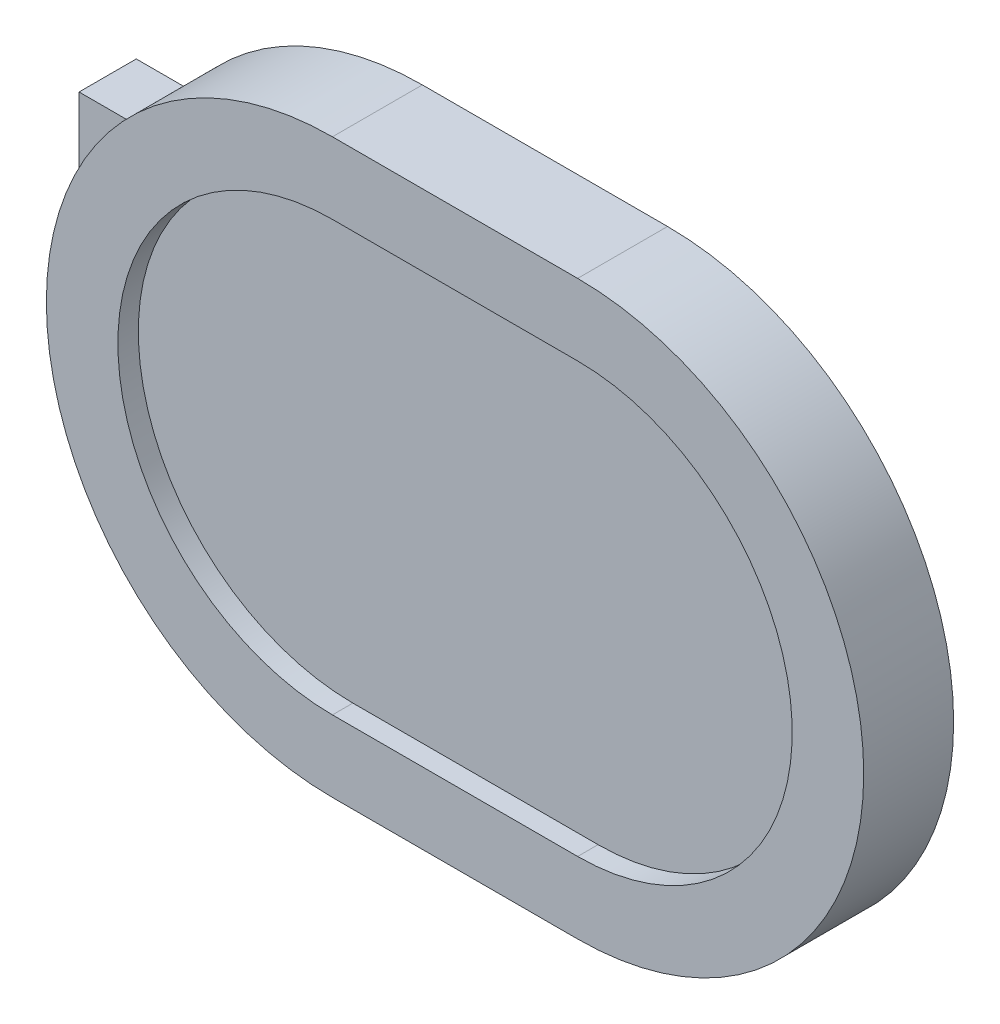
ISO-10303-21;
HEADER;
FILE_DESCRIPTION(('STEP AP214'),'2;1');
FILE_NAME('part.step','',(''),(''),'','','');
FILE_SCHEMA(('AUTOMOTIVE_DESIGN { 1 0 10303 214 1 1 1 1 }'));
ENDSEC;
DATA;
#1=APPLICATION_CONTEXT('core data for automotive mechanical design processes');
#2=APPLICATION_PROTOCOL_DEFINITION('international standard','automotive_design',2000,#1);
#3=PRODUCT_CONTEXT('',#1,'mechanical');
#4=PRODUCT('Part','Part','',(#3));
#5=PRODUCT_RELATED_PRODUCT_CATEGORY('part','',(#4));
#6=PRODUCT_DEFINITION_FORMATION('','',#4);
#7=PRODUCT_DEFINITION_CONTEXT('part definition',#1,'design');
#8=PRODUCT_DEFINITION('design','',#6,#7);
#9=PRODUCT_DEFINITION_SHAPE('','',#8);
#10=(LENGTH_UNIT() NAMED_UNIT(*) SI_UNIT(.MILLI.,.METRE.));
#11=(NAMED_UNIT(*) PLANE_ANGLE_UNIT() SI_UNIT($,.RADIAN.));
#12=(NAMED_UNIT(*) SI_UNIT($,.STERADIAN.) SOLID_ANGLE_UNIT());
#13=UNCERTAINTY_MEASURE_WITH_UNIT(LENGTH_MEASURE(1.E-05),#10,'distance_accuracy_value','');
#14=(GEOMETRIC_REPRESENTATION_CONTEXT(3) GLOBAL_UNCERTAINTY_ASSIGNED_CONTEXT((#13)) GLOBAL_UNIT_ASSIGNED_CONTEXT((#10,
#11,#12)) REPRESENTATION_CONTEXT('',''));
#15=CARTESIAN_POINT('',(0.,0.,0.));
#16=DIRECTION('',(0.,0.,1.));
#17=DIRECTION('',(1.,0.,0.));
#18=AXIS2_PLACEMENT_3D('',#15,#16,#17);
#19=CARTESIAN_POINT('',(3.,0.,0.8));
#20=DIRECTION('',(0.,0.,1.));
#21=DIRECTION('',(1.,0.,0.));
#22=AXIS2_PLACEMENT_3D('',#19,#20,#21);
#23=PLANE('',#22);
#24=DIRECTION('',(0.,1.,0.));
#25=VECTOR('',#24,1.);
#26=CARTESIAN_POINT('',(-9.7,1.25,0.8));
#27=LINE('',#26,#25);
#28=CARTESIAN_POINT('',(-9.7,1.25,0.8));
#29=VERTEX_POINT('',#28);
#30=CARTESIAN_POINT('',(-9.7,3.75,0.8));
#31=VERTEX_POINT('',#30);
#32=EDGE_CURVE('E201',#29,#31,#27,.T.);
#33=ORIENTED_EDGE('',*,*,#32,.F.);
#34=DIRECTION('',(-1.,0.,0.));
#35=VECTOR('',#34,1.);
#36=CARTESIAN_POINT('',(-7.2,1.25,0.8));
#37=LINE('',#36,#35);
#38=CARTESIAN_POINT('',(-7.2,1.25,0.8));
#39=VERTEX_POINT('',#38);
#40=EDGE_CURVE('E214',#39,#29,#37,.T.);
#41=ORIENTED_EDGE('',*,*,#40,.F.);
#42=DIRECTION('',(0.,-1.,0.));
#43=VECTOR('',#42,1.);
#44=CARTESIAN_POINT('',(-7.2,1.25,0.8));
#45=LINE('',#44,#43);
#46=CARTESIAN_POINT('',(-7.2,3.75,0.8));
#47=VERTEX_POINT('',#46);
#48=EDGE_CURVE('E223',#47,#39,#45,.T.);
#49=ORIENTED_EDGE('',*,*,#48,.F.);
#50=DIRECTION('',(1.,0.,0.));
#51=VECTOR('',#50,1.);
#52=CARTESIAN_POINT('',(-7.2,3.75,0.8));
#53=LINE('',#52,#51);
#54=EDGE_CURVE('E204',#31,#47,#53,.T.);
#55=ORIENTED_EDGE('',*,*,#54,.F.);
#56=EDGE_LOOP('',(#33,#41,#49,#55));
#57=FACE_BOUND('',#56,.T.);
#58=CARTESIAN_POINT('',(0.,0.,0.8));
#59=DIRECTION('',(0.,0.,1.));
#60=DIRECTION('',(1.,0.,0.));
#61=AXIS2_PLACEMENT_3D('',#58,#59,#60);
#62=CIRCLE('',#61,5.3);
#63=CARTESIAN_POINT('',(5.3,0.,0.8));
#64=VERTEX_POINT('',#63);
#65=EDGE_CURVE('E335',#64,#64,#62,.T.);
#66=ORIENTED_EDGE('',*,*,#65,.T.);
#67=EDGE_LOOP('',(#66));
#68=FACE_BOUND('',#67,.T.);
#69=CARTESIAN_POINT('',(-3.,0.,0.8));
#70=DIRECTION('',(0.,0.,1.));
#71=DIRECTION('',(1.,0.,0.));
#72=AXIS2_PLACEMENT_3D('',#69,#70,#71);
#73=CIRCLE('',#72,7.);
#74=CARTESIAN_POINT('',(-8.7094220372994,-4.05,0.8));
#75=VERTEX_POINT('',#74);
#76=CARTESIAN_POINT('',(-3.,-7.,0.8));
#77=VERTEX_POINT('',#76);
#78=EDGE_CURVE('E309',#75,#77,#73,.T.);
#79=ORIENTED_EDGE('',*,*,#78,.F.);
#80=DIRECTION('',(-1.,0.,0.));
#81=VECTOR('',#80,1.);
#82=CARTESIAN_POINT('',(-10.,-4.05,0.8));
#83=LINE('',#82,#81);
#84=CARTESIAN_POINT('',(-10.,-4.05,0.8));
#85=VERTEX_POINT('',#84);
#86=EDGE_CURVE('E239',#75,#85,#83,.T.);
#87=ORIENTED_EDGE('',*,*,#86,.T.);
#88=DIRECTION('',(0.,1.,0.));
#89=VECTOR('',#88,1.);
#90=CARTESIAN_POINT('',(-10.,4.05,0.8));
#91=LINE('',#90,#89);
#92=CARTESIAN_POINT('',(-10.,4.05,0.8));
#93=VERTEX_POINT('',#92);
#94=EDGE_CURVE('E244',#85,#93,#91,.T.);
#95=ORIENTED_EDGE('',*,*,#94,.T.);
#96=DIRECTION('',(1.,0.,0.));
#97=VECTOR('',#96,1.);
#98=CARTESIAN_POINT('',(-8.7094220372994,4.05,0.8));
#99=LINE('',#98,#97);
#100=CARTESIAN_POINT('',(-8.7094220372994,4.05,0.8));
#101=VERTEX_POINT('',#100);
#102=EDGE_CURVE('E240',#93,#101,#99,.T.);
#103=ORIENTED_EDGE('',*,*,#102,.T.);
#104=CARTESIAN_POINT('',(-3.,7.,0.8));
#105=VERTEX_POINT('',#104);
#106=EDGE_CURVE('E306',#105,#101,#73,.T.);
#107=ORIENTED_EDGE('',*,*,#106,.F.);
#108=DIRECTION('',(-1.,0.,0.));
#109=VECTOR('',#108,1.);
#110=CARTESIAN_POINT('',(3.,7.,0.8));
#111=LINE('',#110,#109);
#112=CARTESIAN_POINT('',(3.,7.,0.8));
#113=VERTEX_POINT('',#112);
#114=EDGE_CURVE('E310',#113,#105,#111,.T.);
#115=ORIENTED_EDGE('',*,*,#114,.F.);
#116=CARTESIAN_POINT('',(3.,0.,0.8));
#117=DIRECTION('',(0.,0.,1.));
#118=DIRECTION('',(1.,0.,0.));
#119=AXIS2_PLACEMENT_3D('',#116,#117,#118);
#120=CIRCLE('',#119,7.);
#121=CARTESIAN_POINT('',(3.,-7.,0.8));
#122=VERTEX_POINT('',#121);
#123=EDGE_CURVE('E315',#122,#113,#120,.T.);
#124=ORIENTED_EDGE('',*,*,#123,.F.);
#125=DIRECTION('',(1.,0.,0.));
#126=VECTOR('',#125,1.);
#127=CARTESIAN_POINT('',(3.,-7.,0.8));
#128=LINE('',#127,#126);
#129=EDGE_CURVE('E301',#77,#122,#128,.T.);
#130=ORIENTED_EDGE('',*,*,#129,.F.);
#131=EDGE_LOOP('',(#79,#87,#95,#103,#107,#115,#124,#130));
#132=FACE_BOUND('',#131,.T.);
#133=DIRECTION('',(1.,0.,0.));
#134=VECTOR('',#133,1.);
#135=CARTESIAN_POINT('',(-7.2,-1.25,0.8));
#136=LINE('',#135,#134);
#137=CARTESIAN_POINT('',(-9.7,-1.25,0.8));
#138=VERTEX_POINT('',#137);
#139=CARTESIAN_POINT('',(-7.2,-1.25,0.8));
#140=VERTEX_POINT('',#139);
#141=EDGE_CURVE('E200',#138,#140,#136,.T.);
#142=ORIENTED_EDGE('',*,*,#141,.F.);
#143=DIRECTION('',(0.,1.,0.));
#144=VECTOR('',#143,1.);
#145=CARTESIAN_POINT('',(-9.7,-1.25,0.8));
#146=LINE('',#145,#144);
#147=CARTESIAN_POINT('',(-9.7,-3.75,0.8));
#148=VERTEX_POINT('',#147);
#149=EDGE_CURVE('E197',#148,#138,#146,.T.);
#150=ORIENTED_EDGE('',*,*,#149,.F.);
#151=DIRECTION('',(-1.,0.,0.));
#152=VECTOR('',#151,1.);
#153=CARTESIAN_POINT('',(-7.2,-3.75,0.8));
#154=LINE('',#153,#152);
#155=CARTESIAN_POINT('',(-7.2,-3.75,0.8));
#156=VERTEX_POINT('',#155);
#157=EDGE_CURVE('E60',#156,#148,#154,.T.);
#158=ORIENTED_EDGE('',*,*,#157,.F.);
#159=DIRECTION('',(0.,-1.,0.));
#160=VECTOR('',#159,1.);
#161=CARTESIAN_POINT('',(-7.2,-1.25,0.8));
#162=LINE('',#161,#160);
#163=EDGE_CURVE('E55',#140,#156,#162,.T.);
#164=ORIENTED_EDGE('',*,*,#163,.F.);
#165=EDGE_LOOP('',(#142,#150,#158,#164));
#166=FACE_BOUND('',#165,.T.);
#167=ADVANCED_FACE('F40',(#57,#68,#132,#166),#23,.F.);
#168=CARTESIAN_POINT('',(0.,0.,0.8));
#169=DIRECTION('',(0.,0.,-1.));
#170=DIRECTION('',(-1.,0.,0.));
#171=AXIS2_PLACEMENT_3D('',#168,#169,#170);
#172=CYLINDRICAL_SURFACE('',#171,5.3);
#173=ORIENTED_EDGE('',*,*,#65,.F.);
#174=EDGE_LOOP('',(#173));
#175=FACE_BOUND('',#174,.T.);
#176=CARTESIAN_POINT('',(0.,0.,0.));
#177=DIRECTION('',(0.,0.,1.));
#178=DIRECTION('',(1.,0.,0.));
#179=AXIS2_PLACEMENT_3D('',#176,#177,#178);
#180=CIRCLE('',#179,5.3);
#181=CARTESIAN_POINT('',(5.3,0.,0.));
#182=VERTEX_POINT('',#181);
#183=EDGE_CURVE('E321',#182,#182,#180,.T.);
#184=ORIENTED_EDGE('',*,*,#183,.T.);
#185=EDGE_LOOP('',(#184));
#186=FACE_BOUND('',#185,.T.);
#187=ADVANCED_FACE('F42',(#175,#186),#172,.T.);
#188=CARTESIAN_POINT('',(0.,0.,0.));
#189=DIRECTION('',(0.,0.,1.));
#190=DIRECTION('',(1.,0.,0.));
#191=AXIS2_PLACEMENT_3D('',#188,#189,#190);
#192=PLANE('',#191);
#193=ORIENTED_EDGE('',*,*,#183,.F.);
#194=EDGE_LOOP('',(#193));
#195=FACE_BOUND('',#194,.T.);
#196=ADVANCED_FACE('F341',(#195),#192,.F.);
#197=CARTESIAN_POINT('',(3.,0.,30.4131112314674));
#198=DIRECTION('',(0.,0.,-1.));
#199=DIRECTION('',(-1.,0.,0.));
#200=AXIS2_PLACEMENT_3D('',#197,#198,#199);
#201=CYLINDRICAL_SURFACE('',#200,7.);
#202=CARTESIAN_POINT('',(3.,0.,3.));
#203=DIRECTION('',(0.,0.,1.));
#204=DIRECTION('',(1.,0.,0.));
#205=AXIS2_PLACEMENT_3D('',#202,#203,#204);
#206=CIRCLE('',#205,7.);
#207=CARTESIAN_POINT('',(3.,-7.,3.));
#208=VERTEX_POINT('',#207);
#209=CARTESIAN_POINT('',(3.,7.,3.));
#210=VERTEX_POINT('',#209);
#211=EDGE_CURVE('E325',#208,#210,#206,.T.);
#212=ORIENTED_EDGE('',*,*,#211,.F.);
#213=DIRECTION('',(0.,0.,-1.));
#214=VECTOR('',#213,1.);
#215=CARTESIAN_POINT('',(3.,-7.,30.4131112314674));
#216=LINE('',#215,#214);
#217=EDGE_CURVE('E294',#208,#122,#216,.T.);
#218=ORIENTED_EDGE('',*,*,#217,.T.);
#219=ORIENTED_EDGE('',*,*,#123,.T.);
#220=DIRECTION('',(0.,0.,-1.));
#221=VECTOR('',#220,1.);
#222=CARTESIAN_POINT('',(3.,7.,30.4131112314674));
#223=LINE('',#222,#221);
#224=EDGE_CURVE('E314',#210,#113,#223,.T.);
#225=ORIENTED_EDGE('',*,*,#224,.F.);
#226=EDGE_LOOP('',(#212,#218,#219,#225));
#227=FACE_BOUND('',#226,.T.);
#228=ADVANCED_FACE('F343',(#227),#201,.T.);
#229=CARTESIAN_POINT('',(3.,7.,30.4131112314674));
#230=DIRECTION('',(0.,-1.,0.));
#231=DIRECTION('',(1.,0.,0.));
#232=AXIS2_PLACEMENT_3D('',#229,#230,#231);
#233=PLANE('',#232);
#234=DIRECTION('',(-1.,0.,0.));
#235=VECTOR('',#234,1.);
#236=CARTESIAN_POINT('',(3.,7.,3.));
#237=LINE('',#236,#235);
#238=CARTESIAN_POINT('',(-3.,7.,3.));
#239=VERTEX_POINT('',#238);
#240=EDGE_CURVE('E322',#210,#239,#237,.T.);
#241=ORIENTED_EDGE('',*,*,#240,.F.);
#242=ORIENTED_EDGE('',*,*,#224,.T.);
#243=ORIENTED_EDGE('',*,*,#114,.T.);
#244=DIRECTION('',(0.,0.,-1.));
#245=VECTOR('',#244,1.);
#246=CARTESIAN_POINT('',(-3.,7.,30.4131112314674));
#247=LINE('',#246,#245);
#248=EDGE_CURVE('E313',#239,#105,#247,.T.);
#249=ORIENTED_EDGE('',*,*,#248,.F.);
#250=EDGE_LOOP('',(#241,#242,#243,#249));
#251=FACE_BOUND('',#250,.T.);
#252=ADVANCED_FACE('F348',(#251),#233,.F.);
#253=CARTESIAN_POINT('',(-3.,0.,30.4131112314674));
#254=DIRECTION('',(0.,0.,-1.));
#255=DIRECTION('',(-1.,0.,0.));
#256=AXIS2_PLACEMENT_3D('',#253,#254,#255);
#257=CYLINDRICAL_SURFACE('',#256,7.);
#258=ORIENTED_EDGE('',*,*,#106,.T.);
#259=DIRECTION('',(0.,0.,-1.));
#260=VECTOR('',#259,1.);
#261=CARTESIAN_POINT('',(-8.7094220372994,4.05,11.2021699249533));
#262=LINE('',#261,#260);
#263=CARTESIAN_POINT('',(-8.7094220372994,4.05,2.2));
#264=VERTEX_POINT('',#263);
#265=EDGE_CURVE('E260',#264,#101,#262,.T.);
#266=ORIENTED_EDGE('',*,*,#265,.F.);
#267=CARTESIAN_POINT('',(-3.,0.,2.2));
#268=DIRECTION('',(0.,0.,1.));
#269=DIRECTION('',(1.,0.,0.));
#270=AXIS2_PLACEMENT_3D('',#267,#268,#269);
#271=CIRCLE('',#270,7.);
#272=CARTESIAN_POINT('',(-10.,0.,2.2));
#273=VERTEX_POINT('',#272);
#274=EDGE_CURVE('E12',#264,#273,#271,.T.);
#275=ORIENTED_EDGE('',*,*,#274,.T.);
#276=CARTESIAN_POINT('',(-8.7094220372994,-4.05,2.2));
#277=VERTEX_POINT('',#276);
#278=EDGE_CURVE('E44',#273,#277,#271,.T.);
#279=ORIENTED_EDGE('',*,*,#278,.T.);
#280=DIRECTION('',(0.,0.,-1.));
#281=VECTOR('',#280,1.);
#282=CARTESIAN_POINT('',(-8.7094220372994,-4.05,11.2021699249533));
#283=LINE('',#282,#281);
#284=EDGE_CURVE('E256',#277,#75,#283,.T.);
#285=ORIENTED_EDGE('',*,*,#284,.T.);
#286=ORIENTED_EDGE('',*,*,#78,.T.);
#287=DIRECTION('',(0.,0.,-1.));
#288=VECTOR('',#287,1.);
#289=CARTESIAN_POINT('',(-3.,-7.,30.4131112314674));
#290=LINE('',#289,#288);
#291=CARTESIAN_POINT('',(-3.,-7.,3.));
#292=VERTEX_POINT('',#291);
#293=EDGE_CURVE('E305',#292,#77,#290,.T.);
#294=ORIENTED_EDGE('',*,*,#293,.F.);
#295=CARTESIAN_POINT('',(-3.,0.,3.));
#296=DIRECTION('',(0.,0.,1.));
#297=DIRECTION('',(1.,0.,0.));
#298=AXIS2_PLACEMENT_3D('',#295,#296,#297);
#299=CIRCLE('',#298,7.);
#300=EDGE_CURVE('E318',#239,#292,#299,.T.);
#301=ORIENTED_EDGE('',*,*,#300,.F.);
#302=ORIENTED_EDGE('',*,*,#248,.T.);
#303=EDGE_LOOP('',(#258,#266,#275,#279,#285,#286,#294,#301,#302));
#304=FACE_BOUND('',#303,.T.);
#305=ADVANCED_FACE('F367',(#304),#257,.T.);
#306=CARTESIAN_POINT('',(3.,-7.,30.4131112314674));
#307=DIRECTION('',(0.,1.,0.));
#308=DIRECTION('',(-1.,0.,0.));
#309=AXIS2_PLACEMENT_3D('',#306,#307,#308);
#310=PLANE('',#309);
#311=DIRECTION('',(1.,0.,0.));
#312=VECTOR('',#311,1.);
#313=CARTESIAN_POINT('',(3.,-7.,3.));
#314=LINE('',#313,#312);
#315=EDGE_CURVE('E304',#292,#208,#314,.T.);
#316=ORIENTED_EDGE('',*,*,#315,.F.);
#317=ORIENTED_EDGE('',*,*,#293,.T.);
#318=ORIENTED_EDGE('',*,*,#129,.T.);
#319=ORIENTED_EDGE('',*,*,#217,.F.);
#320=EDGE_LOOP('',(#316,#317,#318,#319));
#321=FACE_BOUND('',#320,.T.);
#322=ADVANCED_FACE('F363',(#321),#310,.F.);
#323=CARTESIAN_POINT('',(0.,0.,3.));
#324=DIRECTION('',(0.,0.,1.));
#325=DIRECTION('',(1.,0.,0.));
#326=AXIS2_PLACEMENT_3D('',#323,#324,#325);
#327=PLANE('',#326);
#328=CARTESIAN_POINT('',(-3.,0.,3.));
#329=DIRECTION('',(0.,0.,1.));
#330=DIRECTION('',(1.,0.,0.));
#331=AXIS2_PLACEMENT_3D('',#328,#329,#330);
#332=CIRCLE('',#331,5.25);
#333=CARTESIAN_POINT('',(-3.,5.25,3.));
#334=VERTEX_POINT('',#333);
#335=CARTESIAN_POINT('',(-3.,-5.25,3.));
#336=VERTEX_POINT('',#335);
#337=EDGE_CURVE('E268',#334,#336,#332,.T.);
#338=ORIENTED_EDGE('',*,*,#337,.F.);
#339=DIRECTION('',(-1.,0.,0.));
#340=VECTOR('',#339,1.);
#341=CARTESIAN_POINT('',(-3.,5.25,3.));
#342=LINE('',#341,#340);
#343=CARTESIAN_POINT('',(3.,5.25,3.));
#344=VERTEX_POINT('',#343);
#345=EDGE_CURVE('E273',#344,#334,#342,.T.);
#346=ORIENTED_EDGE('',*,*,#345,.F.);
#347=CARTESIAN_POINT('',(3.,0.,3.));
#348=DIRECTION('',(0.,0.,1.));
#349=DIRECTION('',(1.,0.,0.));
#350=AXIS2_PLACEMENT_3D('',#347,#348,#349);
#351=CIRCLE('',#350,5.25);
#352=CARTESIAN_POINT('',(3.,-5.25,3.));
#353=VERTEX_POINT('',#352);
#354=EDGE_CURVE('E287',#353,#344,#351,.T.);
#355=ORIENTED_EDGE('',*,*,#354,.F.);
#356=DIRECTION('',(1.,0.,0.));
#357=VECTOR('',#356,1.);
#358=CARTESIAN_POINT('',(-3.,-5.25,3.));
#359=LINE('',#358,#357);
#360=EDGE_CURVE('E284',#336,#353,#359,.T.);
#361=ORIENTED_EDGE('',*,*,#360,.F.);
#362=EDGE_LOOP('',(#338,#346,#355,#361));
#363=FACE_BOUND('',#362,.T.);
#364=ORIENTED_EDGE('',*,*,#315,.T.);
#365=ORIENTED_EDGE('',*,*,#211,.T.);
#366=ORIENTED_EDGE('',*,*,#240,.T.);
#367=ORIENTED_EDGE('',*,*,#300,.T.);
#368=EDGE_LOOP('',(#364,#365,#366,#367));
#369=FACE_BOUND('',#368,.T.);
#370=ADVANCED_FACE('F366',(#363,#369),#327,.T.);
#371=CARTESIAN_POINT('',(-3.,0.,2.5));
#372=DIRECTION('',(0.,0.,1.));
#373=DIRECTION('',(1.,0.,0.));
#374=AXIS2_PLACEMENT_3D('',#371,#372,#373);
#375=CYLINDRICAL_SURFACE('',#374,5.25);
#376=ORIENTED_EDGE('',*,*,#337,.T.);
#377=DIRECTION('',(0.,0.,1.));
#378=VECTOR('',#377,1.);
#379=CARTESIAN_POINT('',(-3.,-5.25,2.5));
#380=LINE('',#379,#378);
#381=CARTESIAN_POINT('',(-3.,-5.25,2.5));
#382=VERTEX_POINT('',#381);
#383=EDGE_CURVE('E282',#382,#336,#380,.T.);
#384=ORIENTED_EDGE('',*,*,#383,.F.);
#385=CARTESIAN_POINT('',(-3.,0.,2.5));
#386=DIRECTION('',(0.,0.,1.));
#387=DIRECTION('',(1.,0.,0.));
#388=AXIS2_PLACEMENT_3D('',#385,#386,#387);
#389=CIRCLE('',#388,5.25);
#390=CARTESIAN_POINT('',(-3.,5.25,2.5));
#391=VERTEX_POINT('',#390);
#392=EDGE_CURVE('E269',#391,#382,#389,.T.);
#393=ORIENTED_EDGE('',*,*,#392,.F.);
#394=DIRECTION('',(0.,0.,1.));
#395=VECTOR('',#394,1.);
#396=CARTESIAN_POINT('',(-3.,5.25,2.5));
#397=LINE('',#396,#395);
#398=EDGE_CURVE('E292',#391,#334,#397,.T.);
#399=ORIENTED_EDGE('',*,*,#398,.T.);
#400=EDGE_LOOP('',(#376,#384,#393,#399));
#401=FACE_BOUND('',#400,.T.);
#402=ADVANCED_FACE('F361',(#401),#375,.F.);
#403=CARTESIAN_POINT('',(-3.,5.25,2.5));
#404=DIRECTION('',(0.,1.,0.));
#405=DIRECTION('',(0.,0.,1.));
#406=AXIS2_PLACEMENT_3D('',#403,#404,#405);
#407=PLANE('',#406);
#408=ORIENTED_EDGE('',*,*,#345,.T.);
#409=ORIENTED_EDGE('',*,*,#398,.F.);
#410=DIRECTION('',(-1.,0.,0.));
#411=VECTOR('',#410,1.);
#412=CARTESIAN_POINT('',(-3.,5.25,2.5));
#413=LINE('',#412,#411);
#414=CARTESIAN_POINT('',(3.,5.25,2.5));
#415=VERTEX_POINT('',#414);
#416=EDGE_CURVE('E279',#415,#391,#413,.T.);
#417=ORIENTED_EDGE('',*,*,#416,.F.);
#418=DIRECTION('',(0.,0.,1.));
#419=VECTOR('',#418,1.);
#420=CARTESIAN_POINT('',(3.,5.25,2.5));
#421=LINE('',#420,#419);
#422=EDGE_CURVE('E295',#415,#344,#421,.T.);
#423=ORIENTED_EDGE('',*,*,#422,.T.);
#424=EDGE_LOOP('',(#408,#409,#417,#423));
#425=FACE_BOUND('',#424,.T.);
#426=ADVANCED_FACE('F379',(#425),#407,.F.);
#427=CARTESIAN_POINT('',(3.,0.,2.5));
#428=DIRECTION('',(0.,0.,1.));
#429=DIRECTION('',(1.,0.,0.));
#430=AXIS2_PLACEMENT_3D('',#427,#428,#429);
#431=CYLINDRICAL_SURFACE('',#430,5.25);
#432=ORIENTED_EDGE('',*,*,#354,.T.);
#433=ORIENTED_EDGE('',*,*,#422,.F.);
#434=CARTESIAN_POINT('',(3.,0.,2.5));
#435=DIRECTION('',(0.,0.,1.));
#436=DIRECTION('',(1.,0.,0.));
#437=AXIS2_PLACEMENT_3D('',#434,#435,#436);
#438=CIRCLE('',#437,5.25);
#439=CARTESIAN_POINT('',(3.,-5.25,2.5));
#440=VERTEX_POINT('',#439);
#441=EDGE_CURVE('E276',#440,#415,#438,.T.);
#442=ORIENTED_EDGE('',*,*,#441,.F.);
#443=DIRECTION('',(0.,0.,1.));
#444=VECTOR('',#443,1.);
#445=CARTESIAN_POINT('',(3.,-5.25,2.5));
#446=LINE('',#445,#444);
#447=EDGE_CURVE('E297',#440,#353,#446,.T.);
#448=ORIENTED_EDGE('',*,*,#447,.T.);
#449=EDGE_LOOP('',(#432,#433,#442,#448));
#450=FACE_BOUND('',#449,.T.);
#451=ADVANCED_FACE('F432',(#450),#431,.F.);
#452=CARTESIAN_POINT('',(-3.,-5.25,2.5));
#453=DIRECTION('',(0.,-1.,0.));
#454=DIRECTION('',(0.,0.,-1.));
#455=AXIS2_PLACEMENT_3D('',#452,#453,#454);
#456=PLANE('',#455);
#457=ORIENTED_EDGE('',*,*,#360,.T.);
#458=ORIENTED_EDGE('',*,*,#447,.F.);
#459=DIRECTION('',(1.,0.,0.));
#460=VECTOR('',#459,1.);
#461=CARTESIAN_POINT('',(-3.,-5.25,2.5));
#462=LINE('',#461,#460);
#463=EDGE_CURVE('E272',#382,#440,#462,.T.);
#464=ORIENTED_EDGE('',*,*,#463,.F.);
#465=ORIENTED_EDGE('',*,*,#383,.T.);
#466=EDGE_LOOP('',(#457,#458,#464,#465));
#467=FACE_BOUND('',#466,.T.);
#468=ADVANCED_FACE('F427',(#467),#456,.F.);
#469=CARTESIAN_POINT('',(-3.,0.,2.5));
#470=DIRECTION('',(0.,0.,1.));
#471=DIRECTION('',(1.,0.,0.));
#472=AXIS2_PLACEMENT_3D('',#469,#470,#471);
#473=PLANE('',#472);
#474=ORIENTED_EDGE('',*,*,#392,.T.);
#475=ORIENTED_EDGE('',*,*,#463,.T.);
#476=ORIENTED_EDGE('',*,*,#441,.T.);
#477=ORIENTED_EDGE('',*,*,#416,.T.);
#478=EDGE_LOOP('',(#474,#475,#476,#477));
#479=FACE_BOUND('',#478,.T.);
#480=ADVANCED_FACE('F423',(#479),#473,.T.);
#481=CARTESIAN_POINT('',(0.,0.,2.2));
#482=DIRECTION('',(0.,0.,1.));
#483=DIRECTION('',(1.,0.,0.));
#484=AXIS2_PLACEMENT_3D('',#481,#482,#483);
#485=PLANE('',#484);
#486=ORIENTED_EDGE('',*,*,#274,.F.);
#487=DIRECTION('',(1.,0.,0.));
#488=VECTOR('',#487,1.);
#489=CARTESIAN_POINT('',(-8.7094220372994,4.05,2.2));
#490=LINE('',#489,#488);
#491=CARTESIAN_POINT('',(-10.,4.05,2.2));
#492=VERTEX_POINT('',#491);
#493=EDGE_CURVE('E257',#492,#264,#490,.T.);
#494=ORIENTED_EDGE('',*,*,#493,.F.);
#495=DIRECTION('',(0.,1.,0.));
#496=VECTOR('',#495,1.);
#497=CARTESIAN_POINT('',(-10.,4.05,2.2));
#498=LINE('',#497,#496);
#499=EDGE_CURVE('E243',#273,#492,#498,.T.);
#500=ORIENTED_EDGE('',*,*,#499,.F.);
#501=EDGE_LOOP('',(#486,#494,#500));
#502=FACE_BOUND('',#501,.T.);
#503=ADVANCED_FACE('F410',(#502),#485,.T.);
#504=CARTESIAN_POINT('',(-10.,4.05,11.2021699249533));
#505=DIRECTION('',(-1.,0.,0.));
#506=DIRECTION('',(0.,0.,1.));
#507=AXIS2_PLACEMENT_3D('',#504,#505,#506);
#508=PLANE('',#507);
#509=ORIENTED_EDGE('',*,*,#94,.F.);
#510=DIRECTION('',(0.,0.,-1.));
#511=VECTOR('',#510,1.);
#512=CARTESIAN_POINT('',(-10.,-4.05,11.2021699249533));
#513=LINE('',#512,#511);
#514=CARTESIAN_POINT('',(-10.,-4.05,2.2));
#515=VERTEX_POINT('',#514);
#516=EDGE_CURVE('E255',#515,#85,#513,.T.);
#517=ORIENTED_EDGE('',*,*,#516,.F.);
#518=EDGE_CURVE('E248',#515,#273,#498,.T.);
#519=ORIENTED_EDGE('',*,*,#518,.T.);
#520=ORIENTED_EDGE('',*,*,#499,.T.);
#521=DIRECTION('',(0.,0.,-1.));
#522=VECTOR('',#521,1.);
#523=CARTESIAN_POINT('',(-10.,4.05,11.2021699249533));
#524=LINE('',#523,#522);
#525=EDGE_CURVE('E251',#492,#93,#524,.T.);
#526=ORIENTED_EDGE('',*,*,#525,.T.);
#527=EDGE_LOOP('',(#509,#517,#519,#520,#526));
#528=FACE_BOUND('',#527,.T.);
#529=ADVANCED_FACE('F403',(#528),#508,.T.);
#530=ORIENTED_EDGE('',*,*,#278,.F.);
#531=ORIENTED_EDGE('',*,*,#518,.F.);
#532=DIRECTION('',(-1.,0.,0.));
#533=VECTOR('',#532,1.);
#534=CARTESIAN_POINT('',(-10.,-4.05,2.2));
#535=LINE('',#534,#533);
#536=EDGE_CURVE('E252',#277,#515,#535,.T.);
#537=ORIENTED_EDGE('',*,*,#536,.F.);
#538=EDGE_LOOP('',(#530,#531,#537));
#539=FACE_BOUND('',#538,.T.);
#540=ADVANCED_FACE('F412',(#539),#485,.T.);
#541=CARTESIAN_POINT('',(-8.7094220372994,4.05,11.2021699249533));
#542=DIRECTION('',(0.,1.,0.));
#543=DIRECTION('',(0.,0.,1.));
#544=AXIS2_PLACEMENT_3D('',#541,#542,#543);
#545=PLANE('',#544);
#546=ORIENTED_EDGE('',*,*,#525,.F.);
#547=ORIENTED_EDGE('',*,*,#493,.T.);
#548=ORIENTED_EDGE('',*,*,#265,.T.);
#549=ORIENTED_EDGE('',*,*,#102,.F.);
#550=EDGE_LOOP('',(#546,#547,#548,#549));
#551=FACE_BOUND('',#550,.T.);
#552=ADVANCED_FACE('F408',(#551),#545,.T.);
#553=CARTESIAN_POINT('',(-10.,-4.05,11.2021699249533));
#554=DIRECTION('',(0.,-1.,0.));
#555=DIRECTION('',(0.,0.,-1.));
#556=AXIS2_PLACEMENT_3D('',#553,#554,#555);
#557=PLANE('',#556);
#558=ORIENTED_EDGE('',*,*,#284,.F.);
#559=ORIENTED_EDGE('',*,*,#536,.T.);
#560=ORIENTED_EDGE('',*,*,#516,.T.);
#561=ORIENTED_EDGE('',*,*,#86,.F.);
#562=EDGE_LOOP('',(#558,#559,#560,#561));
#563=FACE_BOUND('',#562,.T.);
#564=ADVANCED_FACE('F400',(#563),#557,.T.);
#565=CARTESIAN_POINT('',(-9.7,1.25,0.6));
#566=DIRECTION('',(1.,0.,0.));
#567=DIRECTION('',(0.,0.,-1.));
#568=AXIS2_PLACEMENT_3D('',#565,#566,#567);
#569=PLANE('',#568);
#570=ORIENTED_EDGE('',*,*,#32,.T.);
#571=DIRECTION('',(0.,0.,1.));
#572=VECTOR('',#571,1.);
#573=CARTESIAN_POINT('',(-9.7,3.75,0.6));
#574=LINE('',#573,#572);
#575=CARTESIAN_POINT('',(-9.7,3.75,0.6));
#576=VERTEX_POINT('',#575);
#577=EDGE_CURVE('E236',#576,#31,#574,.T.);
#578=ORIENTED_EDGE('',*,*,#577,.F.);
#579=DIRECTION('',(0.,1.,0.));
#580=VECTOR('',#579,1.);
#581=CARTESIAN_POINT('',(-9.7,1.25,0.6));
#582=LINE('',#581,#580);
#583=CARTESIAN_POINT('',(-9.7,1.25,0.6));
#584=VERTEX_POINT('',#583);
#585=EDGE_CURVE('E210',#584,#576,#582,.T.);
#586=ORIENTED_EDGE('',*,*,#585,.F.);
#587=DIRECTION('',(0.,0.,1.));
#588=VECTOR('',#587,1.);
#589=CARTESIAN_POINT('',(-9.7,1.25,0.6));
#590=LINE('',#589,#588);
#591=EDGE_CURVE('E219',#584,#29,#590,.T.);
#592=ORIENTED_EDGE('',*,*,#591,.T.);
#593=EDGE_LOOP('',(#570,#578,#586,#592));
#594=FACE_BOUND('',#593,.T.);
#595=ADVANCED_FACE('F496',(#594),#569,.F.);
#596=CARTESIAN_POINT('',(-7.2,3.75,0.6));
#597=DIRECTION('',(0.,-1.,0.));
#598=DIRECTION('',(0.,0.,-1.));
#599=AXIS2_PLACEMENT_3D('',#596,#597,#598);
#600=PLANE('',#599);
#601=ORIENTED_EDGE('',*,*,#54,.T.);
#602=DIRECTION('',(0.,0.,1.));
#603=VECTOR('',#602,1.);
#604=CARTESIAN_POINT('',(-7.2,3.75,0.6));
#605=LINE('',#604,#603);
#606=CARTESIAN_POINT('',(-7.2,3.75,0.6));
#607=VERTEX_POINT('',#606);
#608=EDGE_CURVE('E233',#607,#47,#605,.T.);
#609=ORIENTED_EDGE('',*,*,#608,.F.);
#610=DIRECTION('',(1.,0.,0.));
#611=VECTOR('',#610,1.);
#612=CARTESIAN_POINT('',(-7.2,3.75,0.6));
#613=LINE('',#612,#611);
#614=EDGE_CURVE('E213',#576,#607,#613,.T.);
#615=ORIENTED_EDGE('',*,*,#614,.F.);
#616=ORIENTED_EDGE('',*,*,#577,.T.);
#617=EDGE_LOOP('',(#601,#609,#615,#616));
#618=FACE_BOUND('',#617,.T.);
#619=ADVANCED_FACE('F511',(#618),#600,.F.);
#620=CARTESIAN_POINT('',(-7.2,1.25,0.6));
#621=DIRECTION('',(-1.,0.,0.));
#622=DIRECTION('',(0.,0.,1.));
#623=AXIS2_PLACEMENT_3D('',#620,#621,#622);
#624=PLANE('',#623);
#625=ORIENTED_EDGE('',*,*,#48,.T.);
#626=DIRECTION('',(0.,0.,1.));
#627=VECTOR('',#626,1.);
#628=CARTESIAN_POINT('',(-7.2,1.25,0.6));
#629=LINE('',#628,#627);
#630=CARTESIAN_POINT('',(-7.2,1.25,0.6));
#631=VERTEX_POINT('',#630);
#632=EDGE_CURVE('E230',#631,#39,#629,.T.);
#633=ORIENTED_EDGE('',*,*,#632,.F.);
#634=DIRECTION('',(0.,-1.,0.));
#635=VECTOR('',#634,1.);
#636=CARTESIAN_POINT('',(-7.2,1.25,0.6));
#637=LINE('',#636,#635);
#638=EDGE_CURVE('E216',#607,#631,#637,.T.);
#639=ORIENTED_EDGE('',*,*,#638,.F.);
#640=ORIENTED_EDGE('',*,*,#608,.T.);
#641=EDGE_LOOP('',(#625,#633,#639,#640));
#642=FACE_BOUND('',#641,.T.);
#643=ADVANCED_FACE('F521',(#642),#624,.F.);
#644=CARTESIAN_POINT('',(-7.2,1.25,0.6));
#645=DIRECTION('',(0.,1.,0.));
#646=DIRECTION('',(0.,0.,1.));
#647=AXIS2_PLACEMENT_3D('',#644,#645,#646);
#648=PLANE('',#647);
#649=ORIENTED_EDGE('',*,*,#40,.T.);
#650=ORIENTED_EDGE('',*,*,#591,.F.);
#651=DIRECTION('',(-1.,0.,0.));
#652=VECTOR('',#651,1.);
#653=CARTESIAN_POINT('',(-7.2,1.25,0.6));
#654=LINE('',#653,#652);
#655=EDGE_CURVE('E218',#631,#584,#654,.T.);
#656=ORIENTED_EDGE('',*,*,#655,.F.);
#657=ORIENTED_EDGE('',*,*,#632,.T.);
#658=EDGE_LOOP('',(#649,#650,#656,#657));
#659=FACE_BOUND('',#658,.T.);
#660=ADVANCED_FACE('F531',(#659),#648,.F.);
#661=CARTESIAN_POINT('',(0.,0.,0.6));
#662=DIRECTION('',(0.,0.,1.));
#663=DIRECTION('',(1.,0.,0.));
#664=AXIS2_PLACEMENT_3D('',#661,#662,#663);
#665=PLANE('',#664);
#666=ORIENTED_EDGE('',*,*,#585,.T.);
#667=ORIENTED_EDGE('',*,*,#614,.T.);
#668=ORIENTED_EDGE('',*,*,#638,.T.);
#669=ORIENTED_EDGE('',*,*,#655,.T.);
#670=EDGE_LOOP('',(#666,#667,#668,#669));
#671=FACE_BOUND('',#670,.T.);
#672=ADVANCED_FACE('F541',(#671),#665,.F.);
#673=CARTESIAN_POINT('',(-7.2,-1.25,0.6));
#674=DIRECTION('',(0.,-1.,0.));
#675=DIRECTION('',(0.,0.,-1.));
#676=AXIS2_PLACEMENT_3D('',#673,#674,#675);
#677=PLANE('',#676);
#678=ORIENTED_EDGE('',*,*,#141,.T.);
#679=DIRECTION('',(0.,0.,1.));
#680=VECTOR('',#679,1.);
#681=CARTESIAN_POINT('',(-7.2,-1.25,0.6));
#682=LINE('',#681,#680);
#683=CARTESIAN_POINT('',(-7.2,-1.25,0.6));
#684=VERTEX_POINT('',#683);
#685=EDGE_CURVE('E181',#684,#140,#682,.T.);
#686=ORIENTED_EDGE('',*,*,#685,.F.);
#687=DIRECTION('',(1.,0.,0.));
#688=VECTOR('',#687,1.);
#689=CARTESIAN_POINT('',(-7.2,-1.25,0.6));
#690=LINE('',#689,#688);
#691=CARTESIAN_POINT('',(-9.7,-1.25,0.6));
#692=VERTEX_POINT('',#691);
#693=EDGE_CURVE('E188',#692,#684,#690,.T.);
#694=ORIENTED_EDGE('',*,*,#693,.F.);
#695=DIRECTION('',(0.,0.,1.));
#696=VECTOR('',#695,1.);
#697=CARTESIAN_POINT('',(-9.7,-1.25,0.6));
#698=LINE('',#697,#696);
#699=EDGE_CURVE('E601',#692,#138,#698,.T.);
#700=ORIENTED_EDGE('',*,*,#699,.T.);
#701=EDGE_LOOP('',(#678,#686,#694,#700));
#702=FACE_BOUND('',#701,.T.);
#703=ADVANCED_FACE('F199',(#702),#677,.F.);
#704=CARTESIAN_POINT('',(-7.2,-1.25,0.6));
#705=DIRECTION('',(-1.,0.,0.));
#706=DIRECTION('',(0.,0.,1.));
#707=AXIS2_PLACEMENT_3D('',#704,#705,#706);
#708=PLANE('',#707);
#709=ORIENTED_EDGE('',*,*,#163,.T.);
#710=DIRECTION('',(0.,0.,1.));
#711=VECTOR('',#710,1.);
#712=CARTESIAN_POINT('',(-7.2,-3.75,0.6));
#713=LINE('',#712,#711);
#714=CARTESIAN_POINT('',(-7.2,-3.75,0.6));
#715=VERTEX_POINT('',#714);
#716=EDGE_CURVE('E184',#715,#156,#713,.T.);
#717=ORIENTED_EDGE('',*,*,#716,.F.);
#718=DIRECTION('',(0.,-1.,0.));
#719=VECTOR('',#718,1.);
#720=CARTESIAN_POINT('',(-7.2,-1.25,0.6));
#721=LINE('',#720,#719);
#722=EDGE_CURVE('E177',#684,#715,#721,.T.);
#723=ORIENTED_EDGE('',*,*,#722,.F.);
#724=ORIENTED_EDGE('',*,*,#685,.T.);
#725=EDGE_LOOP('',(#709,#717,#723,#724));
#726=FACE_BOUND('',#725,.T.);
#727=ADVANCED_FACE('F179',(#726),#708,.F.);
#728=CARTESIAN_POINT('',(-7.2,-3.75,0.6));
#729=DIRECTION('',(0.,1.,0.));
#730=DIRECTION('',(0.,0.,1.));
#731=AXIS2_PLACEMENT_3D('',#728,#729,#730);
#732=PLANE('',#731);
#733=ORIENTED_EDGE('',*,*,#157,.T.);
#734=DIRECTION('',(0.,0.,1.));
#735=VECTOR('',#734,1.);
#736=CARTESIAN_POINT('',(-9.7,-3.75,0.6));
#737=LINE('',#736,#735);
#738=CARTESIAN_POINT('',(-9.7,-3.75,0.6));
#739=VERTEX_POINT('',#738);
#740=EDGE_CURVE('E206',#739,#148,#737,.T.);
#741=ORIENTED_EDGE('',*,*,#740,.F.);
#742=DIRECTION('',(-1.,0.,0.));
#743=VECTOR('',#742,1.);
#744=CARTESIAN_POINT('',(-7.2,-3.75,0.6));
#745=LINE('',#744,#743);
#746=EDGE_CURVE('E187',#715,#739,#745,.T.);
#747=ORIENTED_EDGE('',*,*,#746,.F.);
#748=ORIENTED_EDGE('',*,*,#716,.T.);
#749=EDGE_LOOP('',(#733,#741,#747,#748));
#750=FACE_BOUND('',#749,.T.);
#751=ADVANCED_FACE('F568',(#750),#732,.F.);
#752=CARTESIAN_POINT('',(-9.7,-1.25,0.6));
#753=DIRECTION('',(1.,0.,0.));
#754=DIRECTION('',(0.,0.,-1.));
#755=AXIS2_PLACEMENT_3D('',#752,#753,#754);
#756=PLANE('',#755);
#757=ORIENTED_EDGE('',*,*,#149,.T.);
#758=ORIENTED_EDGE('',*,*,#699,.F.);
#759=DIRECTION('',(0.,1.,0.));
#760=VECTOR('',#759,1.);
#761=CARTESIAN_POINT('',(-9.7,-1.25,0.6));
#762=LINE('',#761,#760);
#763=EDGE_CURVE('E193',#739,#692,#762,.T.);
#764=ORIENTED_EDGE('',*,*,#763,.F.);
#765=ORIENTED_EDGE('',*,*,#740,.T.);
#766=EDGE_LOOP('',(#757,#758,#764,#765));
#767=FACE_BOUND('',#766,.T.);
#768=ADVANCED_FACE('F577',(#767),#756,.F.);
#769=CARTESIAN_POINT('',(0.,0.,0.6));
#770=DIRECTION('',(0.,0.,1.));
#771=DIRECTION('',(1.,0.,0.));
#772=AXIS2_PLACEMENT_3D('',#769,#770,#771);
#773=PLANE('',#772);
#774=ORIENTED_EDGE('',*,*,#693,.T.);
#775=ORIENTED_EDGE('',*,*,#722,.T.);
#776=ORIENTED_EDGE('',*,*,#746,.T.);
#777=ORIENTED_EDGE('',*,*,#763,.T.);
#778=EDGE_LOOP('',(#774,#775,#776,#777));
#779=FACE_BOUND('',#778,.T.);
#780=ADVANCED_FACE('F191',(#779),#773,.F.);
#781=CLOSED_SHELL('',(#167,#187,#196,#228,#252,#305,#322,#370,#402,#426,#451,#468,#480,#503,
#529,#540,#552,#564,#595,#619,#643,#660,#672,#703,#727,#751,#768,#780));
#782=MANIFOLD_SOLID_BREP('B2',#781);
#783=ADVANCED_BREP_SHAPE_REPRESENTATION('',(#18,#782),#14);
#784=SHAPE_DEFINITION_REPRESENTATION(#9,#783);
ENDSEC;
END-ISO-10303-21;
